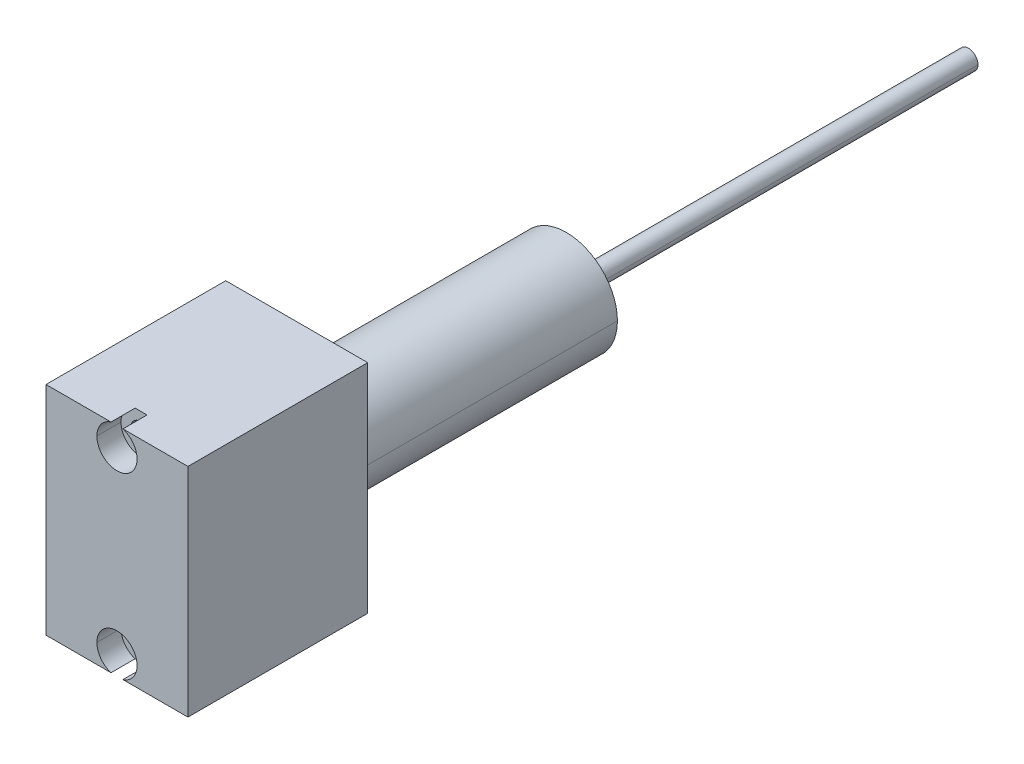
ISO-10303-21;
HEADER;
FILE_DESCRIPTION(('STEP AP214'),'2;1');
FILE_NAME('part.step','',(''),(''),'','','');
FILE_SCHEMA(('AUTOMOTIVE_DESIGN { 1 0 10303 214 1 1 1 1 }'));
ENDSEC;
DATA;
#1=APPLICATION_CONTEXT('core data for automotive mechanical design processes');
#2=APPLICATION_PROTOCOL_DEFINITION('international standard','automotive_design',2000,#1);
#3=PRODUCT_CONTEXT('',#1,'mechanical');
#4=PRODUCT('Part','Part','',(#3));
#5=PRODUCT_RELATED_PRODUCT_CATEGORY('part','',(#4));
#6=PRODUCT_DEFINITION_FORMATION('','',#4);
#7=PRODUCT_DEFINITION_CONTEXT('part definition',#1,'design');
#8=PRODUCT_DEFINITION('design','',#6,#7);
#9=PRODUCT_DEFINITION_SHAPE('','',#8);
#10=(LENGTH_UNIT() NAMED_UNIT(*) SI_UNIT(.MILLI.,.METRE.));
#11=(NAMED_UNIT(*) PLANE_ANGLE_UNIT() SI_UNIT($,.RADIAN.));
#12=(NAMED_UNIT(*) SI_UNIT($,.STERADIAN.) SOLID_ANGLE_UNIT());
#13=UNCERTAINTY_MEASURE_WITH_UNIT(LENGTH_MEASURE(1.E-05),#10,'distance_accuracy_value','');
#14=(GEOMETRIC_REPRESENTATION_CONTEXT(3) GLOBAL_UNCERTAINTY_ASSIGNED_CONTEXT((#13)) GLOBAL_UNIT_ASSIGNED_CONTEXT((#10,
#11,#12)) REPRESENTATION_CONTEXT('',''));
#15=CARTESIAN_POINT('',(0.,0.,0.));
#16=DIRECTION('',(0.,0.,1.));
#17=DIRECTION('',(1.,0.,0.));
#18=AXIS2_PLACEMENT_3D('',#15,#16,#17);
#19=CARTESIAN_POINT('',(-76.,-20.,853.422000000895));
#20=DIRECTION('',(0.,0.,1.));
#21=DIRECTION('',(1.,0.,0.));
#22=AXIS2_PLACEMENT_3D('',#19,#20,#21);
#23=CYLINDRICAL_SURFACE('',#22,1.19);
#24=CARTESIAN_POINT('',(-76.,-20.,853.422000000895));
#25=DIRECTION('',(0.,0.,-1.));
#26=DIRECTION('',(-1.,0.,0.));
#27=AXIS2_PLACEMENT_3D('',#24,#25,#26);
#28=CIRCLE('',#27,1.19);
#29=CARTESIAN_POINT('',(-77.19,-20.,853.422000000895));
#30=VERTEX_POINT('',#29);
#31=CARTESIAN_POINT('',(-74.81,-20.,853.422000000895));
#32=VERTEX_POINT('',#31);
#33=EDGE_CURVE('E41',#30,#32,#28,.T.);
#34=ORIENTED_EDGE('',*,*,#33,.F.);
#35=DIRECTION('',(0.,0.,1.));
#36=VECTOR('',#35,1.);
#37=CARTESIAN_POINT('',(-77.19,-20.,853.422000000895));
#38=LINE('',#37,#36);
#39=CARTESIAN_POINT('',(-77.19,-20.,903.422000000895));
#40=VERTEX_POINT('',#39);
#41=EDGE_CURVE('E11',#30,#40,#38,.T.);
#42=ORIENTED_EDGE('',*,*,#41,.T.);
#43=CARTESIAN_POINT('',(-76.,-20.,903.422000000895));
#44=DIRECTION('',(0.,0.,-1.));
#45=DIRECTION('',(-1.,0.,0.));
#46=AXIS2_PLACEMENT_3D('',#43,#44,#45);
#47=CIRCLE('',#46,1.19);
#48=CARTESIAN_POINT('',(-74.81,-20.,903.422000000895));
#49=VERTEX_POINT('',#48);
#50=EDGE_CURVE('E27',#40,#49,#47,.T.);
#51=ORIENTED_EDGE('',*,*,#50,.T.);
#52=DIRECTION('',(0.,0.,1.));
#53=VECTOR('',#52,1.);
#54=CARTESIAN_POINT('',(-74.81,-20.,853.422000000895));
#55=LINE('',#54,#53);
#56=EDGE_CURVE('E156',#32,#49,#55,.T.);
#57=ORIENTED_EDGE('',*,*,#56,.F.);
#58=EDGE_LOOP('',(#34,#42,#51,#57));
#59=FACE_BOUND('',#58,.T.);
#60=ADVANCED_FACE('F16',(#59),#23,.T.);
#61=CARTESIAN_POINT('',(-76.,-20.,903.422000000895));
#62=DIRECTION('',(0.,0.,1.));
#63=DIRECTION('',(1.,0.,0.));
#64=AXIS2_PLACEMENT_3D('',#61,#62,#63);
#65=CYLINDRICAL_SURFACE('',#64,6.35);
#66=CARTESIAN_POINT('',(-76.,-20.,903.422000000895));
#67=DIRECTION('',(0.,0.,-1.));
#68=DIRECTION('',(-1.,0.,0.));
#69=AXIS2_PLACEMENT_3D('',#66,#67,#68);
#70=CIRCLE('',#69,6.35);
#71=CARTESIAN_POINT('',(-82.35,-20.,903.422000000895));
#72=VERTEX_POINT('',#71);
#73=CARTESIAN_POINT('',(-69.65,-20.,903.422000000895));
#74=VERTEX_POINT('',#73);
#75=EDGE_CURVE('E264',#72,#74,#70,.T.);
#76=ORIENTED_EDGE('',*,*,#75,.F.);
#77=DIRECTION('',(0.,0.,1.));
#78=VECTOR('',#77,1.);
#79=CARTESIAN_POINT('',(-82.35,-20.,903.422000000895));
#80=LINE('',#79,#78);
#81=CARTESIAN_POINT('',(-82.35,-20.,936.950000000895));
#82=VERTEX_POINT('',#81);
#83=EDGE_CURVE('E247',#72,#82,#80,.T.);
#84=ORIENTED_EDGE('',*,*,#83,.T.);
#85=CARTESIAN_POINT('',(-76.,-20.,936.950000000895));
#86=DIRECTION('',(0.,0.,-1.));
#87=DIRECTION('',(-1.,0.,0.));
#88=AXIS2_PLACEMENT_3D('',#85,#86,#87);
#89=CIRCLE('',#88,6.35);
#90=CARTESIAN_POINT('',(-69.65,-20.,936.950000000895));
#91=VERTEX_POINT('',#90);
#92=EDGE_CURVE('E181',#82,#91,#89,.T.);
#93=ORIENTED_EDGE('',*,*,#92,.T.);
#94=DIRECTION('',(0.,0.,1.));
#95=VECTOR('',#94,1.);
#96=CARTESIAN_POINT('',(-69.65,-20.,903.422000000895));
#97=LINE('',#96,#95);
#98=EDGE_CURVE('E170',#74,#91,#97,.T.);
#99=ORIENTED_EDGE('',*,*,#98,.F.);
#100=EDGE_LOOP('',(#76,#84,#93,#99));
#101=FACE_BOUND('',#100,.T.);
#102=ADVANCED_FACE('F18',(#101),#65,.T.);
#103=CARTESIAN_POINT('',(-76.,-31.1125,956.302000000895));
#104=DIRECTION('',(0.,0.,1.));
#105=DIRECTION('',(1.,0.,0.));
#106=AXIS2_PLACEMENT_3D('',#103,#104,#105);
#107=CYLINDRICAL_SURFACE('',#106,2.5);
#108=CARTESIAN_POINT('',(-76.,-31.1125,956.302000000895));
#109=DIRECTION('',(0.,0.,1.));
#110=DIRECTION('',(1.,0.,0.));
#111=AXIS2_PLACEMENT_3D('',#108,#109,#110);
#112=CIRCLE('',#111,2.5);
#113=CARTESIAN_POINT('',(-78.5,-31.1125,956.302000000895));
#114=VERTEX_POINT('',#113);
#115=CARTESIAN_POINT('',(-76.7415144974982,-33.5,956.302000000895));
#116=VERTEX_POINT('',#115);
#117=EDGE_CURVE('E353',#114,#116,#112,.T.);
#118=ORIENTED_EDGE('',*,*,#117,.F.);
#119=DIRECTION('',(0.,0.,1.));
#120=VECTOR('',#119,1.);
#121=CARTESIAN_POINT('',(-78.5,-31.1125,956.302000000895));
#122=LINE('',#121,#120);
#123=CARTESIAN_POINT('',(-78.5,-31.1125,959.302000000895));
#124=VERTEX_POINT('',#123);
#125=EDGE_CURVE('E282',#114,#124,#122,.T.);
#126=ORIENTED_EDGE('',*,*,#125,.T.);
#127=CARTESIAN_POINT('',(-76.,-31.1125,959.302000000895));
#128=DIRECTION('',(0.,0.,1.));
#129=DIRECTION('',(1.,0.,0.));
#130=AXIS2_PLACEMENT_3D('',#127,#128,#129);
#131=CIRCLE('',#130,2.5);
#132=CARTESIAN_POINT('',(-76.7415144974982,-33.5,959.302000000895));
#133=VERTEX_POINT('',#132);
#134=EDGE_CURVE('E285',#124,#133,#131,.T.);
#135=ORIENTED_EDGE('',*,*,#134,.T.);
#136=DIRECTION('',(0.,0.,1.));
#137=VECTOR('',#136,1.);
#138=CARTESIAN_POINT('',(-76.7415144974982,-33.5,956.302000000895));
#139=LINE('',#138,#137);
#140=EDGE_CURVE('E291',#116,#133,#139,.T.);
#141=ORIENTED_EDGE('',*,*,#140,.F.);
#142=EDGE_LOOP('',(#118,#126,#135,#141));
#143=FACE_BOUND('',#142,.T.);
#144=ADVANCED_FACE('F444',(#143),#107,.F.);
#145=CARTESIAN_POINT('',(-76.,-31.1125,956.302000000895));
#146=DIRECTION('',(0.,0.,1.));
#147=DIRECTION('',(1.,0.,0.));
#148=AXIS2_PLACEMENT_3D('',#145,#146,#147);
#149=CYLINDRICAL_SURFACE('',#148,2.5);
#150=ORIENTED_EDGE('',*,*,#125,.F.);
#151=CARTESIAN_POINT('',(-76.,-31.1125,956.302000000895));
#152=DIRECTION('',(0.,0.,1.));
#153=DIRECTION('',(1.,0.,0.));
#154=AXIS2_PLACEMENT_3D('',#151,#152,#153);
#155=CIRCLE('',#154,2.5);
#156=CARTESIAN_POINT('',(-73.5,-31.1125,956.302000000895));
#157=VERTEX_POINT('',#156);
#158=EDGE_CURVE('E20',#157,#114,#155,.T.);
#159=ORIENTED_EDGE('',*,*,#158,.F.);
#160=DIRECTION('',(0.,0.,1.));
#161=VECTOR('',#160,1.);
#162=CARTESIAN_POINT('',(-73.5,-31.1125,956.302000000895));
#163=LINE('',#162,#161);
#164=CARTESIAN_POINT('',(-73.5,-31.1125,959.302000000895));
#165=VERTEX_POINT('',#164);
#166=EDGE_CURVE('E311',#157,#165,#163,.T.);
#167=ORIENTED_EDGE('',*,*,#166,.T.);
#168=CARTESIAN_POINT('',(-76.,-31.1125,959.302000000895));
#169=DIRECTION('',(0.,0.,1.));
#170=DIRECTION('',(1.,0.,0.));
#171=AXIS2_PLACEMENT_3D('',#168,#169,#170);
#172=CIRCLE('',#171,2.5);
#173=EDGE_CURVE('E307',#165,#124,#172,.T.);
#174=ORIENTED_EDGE('',*,*,#173,.T.);
#175=EDGE_LOOP('',(#150,#159,#167,#174));
#176=FACE_BOUND('',#175,.T.);
#177=ADVANCED_FACE('F449',(#176),#149,.F.);
#178=CARTESIAN_POINT('',(-76.,-8.8875,956.302000000895));
#179=DIRECTION('',(0.,0.,1.));
#180=DIRECTION('',(1.,0.,0.));
#181=AXIS2_PLACEMENT_3D('',#178,#179,#180);
#182=CYLINDRICAL_SURFACE('',#181,2.5);
#183=CARTESIAN_POINT('',(-76.,-8.8875,956.302000000895));
#184=DIRECTION('',(0.,0.,1.));
#185=DIRECTION('',(1.,0.,0.));
#186=AXIS2_PLACEMENT_3D('',#183,#184,#185);
#187=CIRCLE('',#186,2.5);
#188=CARTESIAN_POINT('',(-78.5,-8.8875,956.302000000895));
#189=VERTEX_POINT('',#188);
#190=CARTESIAN_POINT('',(-73.5,-8.8875,956.302000000895));
#191=VERTEX_POINT('',#190);
#192=EDGE_CURVE('E221',#189,#191,#187,.T.);
#193=ORIENTED_EDGE('',*,*,#192,.F.);
#194=DIRECTION('',(0.,0.,1.));
#195=VECTOR('',#194,1.);
#196=CARTESIAN_POINT('',(-78.5,-8.8875,956.302000000895));
#197=LINE('',#196,#195);
#198=CARTESIAN_POINT('',(-78.5,-8.8875,959.302000000895));
#199=VERTEX_POINT('',#198);
#200=EDGE_CURVE('E219',#189,#199,#197,.T.);
#201=ORIENTED_EDGE('',*,*,#200,.T.);
#202=CARTESIAN_POINT('',(-76.,-8.8875,959.302000000895));
#203=DIRECTION('',(0.,0.,1.));
#204=DIRECTION('',(1.,0.,0.));
#205=AXIS2_PLACEMENT_3D('',#202,#203,#204);
#206=CIRCLE('',#205,2.5);
#207=CARTESIAN_POINT('',(-73.5,-8.8875,959.302000000895));
#208=VERTEX_POINT('',#207);
#209=EDGE_CURVE('E325',#199,#208,#206,.T.);
#210=ORIENTED_EDGE('',*,*,#209,.T.);
#211=DIRECTION('',(0.,0.,1.));
#212=VECTOR('',#211,1.);
#213=CARTESIAN_POINT('',(-73.5,-8.8875,956.302000000895));
#214=LINE('',#213,#212);
#215=EDGE_CURVE('E318',#191,#208,#214,.T.);
#216=ORIENTED_EDGE('',*,*,#215,.F.);
#217=EDGE_LOOP('',(#193,#201,#210,#216));
#218=FACE_BOUND('',#217,.T.);
#219=ADVANCED_FACE('F452',(#218),#182,.F.);
#220=CARTESIAN_POINT('',(-76.,-8.8875,956.302000000895));
#221=DIRECTION('',(0.,0.,1.));
#222=DIRECTION('',(1.,0.,0.));
#223=AXIS2_PLACEMENT_3D('',#220,#221,#222);
#224=CYLINDRICAL_SURFACE('',#223,2.5);
#225=CARTESIAN_POINT('',(-76.,-8.8875,956.302000000895));
#226=DIRECTION('',(0.,0.,1.));
#227=DIRECTION('',(1.,0.,0.));
#228=AXIS2_PLACEMENT_3D('',#225,#226,#227);
#229=CIRCLE('',#228,2.5);
#230=CARTESIAN_POINT('',(-75.2584855025018,-6.5,956.302000000895));
#231=VERTEX_POINT('',#230);
#232=EDGE_CURVE('E199',#191,#231,#229,.T.);
#233=ORIENTED_EDGE('',*,*,#232,.F.);
#234=ORIENTED_EDGE('',*,*,#215,.T.);
#235=CARTESIAN_POINT('',(-76.,-8.8875,959.302000000895));
#236=DIRECTION('',(0.,0.,1.));
#237=DIRECTION('',(1.,0.,0.));
#238=AXIS2_PLACEMENT_3D('',#235,#236,#237);
#239=CIRCLE('',#238,2.5);
#240=CARTESIAN_POINT('',(-75.2584855025018,-6.5,959.302000000895));
#241=VERTEX_POINT('',#240);
#242=EDGE_CURVE('E314',#208,#241,#239,.T.);
#243=ORIENTED_EDGE('',*,*,#242,.T.);
#244=DIRECTION('',(0.,0.,1.));
#245=VECTOR('',#244,1.);
#246=CARTESIAN_POINT('',(-75.2584855025018,-6.5,956.302000000895));
#247=LINE('',#246,#245);
#248=EDGE_CURVE('E301',#231,#241,#247,.T.);
#249=ORIENTED_EDGE('',*,*,#248,.F.);
#250=EDGE_LOOP('',(#233,#234,#243,#249));
#251=FACE_BOUND('',#250,.T.);
#252=ADVANCED_FACE('F448',(#251),#224,.F.);
#253=CARTESIAN_POINT('',(-76.,-8.8875,936.950000000895));
#254=DIRECTION('',(0.,0.,1.));
#255=DIRECTION('',(1.,0.,0.));
#256=AXIS2_PLACEMENT_3D('',#253,#254,#255);
#257=CYLINDRICAL_SURFACE('',#256,1.3);
#258=CARTESIAN_POINT('',(-76.,-8.8875,936.950000000895));
#259=DIRECTION('',(0.,0.,1.));
#260=DIRECTION('',(1.,0.,0.));
#261=AXIS2_PLACEMENT_3D('',#258,#259,#260);
#262=CIRCLE('',#261,1.3);
#263=CARTESIAN_POINT('',(-77.3,-8.8875,936.950000000895));
#264=VERTEX_POINT('',#263);
#265=CARTESIAN_POINT('',(-74.7,-8.8875,936.950000000895));
#266=VERTEX_POINT('',#265);
#267=EDGE_CURVE('E277',#264,#266,#262,.T.);
#268=ORIENTED_EDGE('',*,*,#267,.F.);
#269=DIRECTION('',(0.,0.,1.));
#270=VECTOR('',#269,1.);
#271=CARTESIAN_POINT('',(-77.3,-8.8875,936.950000000895));
#272=LINE('',#271,#270);
#273=CARTESIAN_POINT('',(-77.3,-8.8875,956.302000000895));
#274=VERTEX_POINT('',#273);
#275=EDGE_CURVE('E319',#264,#274,#272,.T.);
#276=ORIENTED_EDGE('',*,*,#275,.T.);
#277=CARTESIAN_POINT('',(-76.,-8.8875,956.302000000895));
#278=DIRECTION('',(0.,0.,-1.));
#279=DIRECTION('',(1.,0.,0.));
#280=AXIS2_PLACEMENT_3D('',#277,#278,#279);
#281=CIRCLE('',#280,1.3);
#282=CARTESIAN_POINT('',(-74.7,-8.8875,956.302000000895));
#283=VERTEX_POINT('',#282);
#284=EDGE_CURVE('E257',#283,#274,#281,.T.);
#285=ORIENTED_EDGE('',*,*,#284,.F.);
#286=DIRECTION('',(0.,0.,1.));
#287=VECTOR('',#286,1.);
#288=CARTESIAN_POINT('',(-74.7,-8.8875,936.950000000895));
#289=LINE('',#288,#287);
#290=EDGE_CURVE('E244',#266,#283,#289,.T.);
#291=ORIENTED_EDGE('',*,*,#290,.F.);
#292=EDGE_LOOP('',(#268,#276,#285,#291));
#293=FACE_BOUND('',#292,.T.);
#294=ADVANCED_FACE('F424',(#293),#257,.F.);
#295=CARTESIAN_POINT('',(-76.,-31.1125,936.950000000895));
#296=DIRECTION('',(0.,0.,1.));
#297=DIRECTION('',(1.,0.,0.));
#298=AXIS2_PLACEMENT_3D('',#295,#296,#297);
#299=CYLINDRICAL_SURFACE('',#298,1.19972449295151);
#300=CARTESIAN_POINT('',(-76.,-31.1125,936.950000000895));
#301=DIRECTION('',(0.,0.,1.));
#302=DIRECTION('',(1.,0.,0.));
#303=AXIS2_PLACEMENT_3D('',#300,#301,#302);
#304=CIRCLE('',#303,1.19972449295151);
#305=CARTESIAN_POINT('',(-77.1997244929515,-31.1125,936.950000000895));
#306=VERTEX_POINT('',#305);
#307=CARTESIAN_POINT('',(-74.8002755070485,-31.1125,936.950000000895));
#308=VERTEX_POINT('',#307);
#309=EDGE_CURVE('E243',#306,#308,#304,.T.);
#310=ORIENTED_EDGE('',*,*,#309,.F.);
#311=DIRECTION('',(0.,0.,1.));
#312=VECTOR('',#311,1.);
#313=CARTESIAN_POINT('',(-77.1997244929515,-31.1125,936.950000000895));
#314=LINE('',#313,#312);
#315=CARTESIAN_POINT('',(-77.1997244929515,-31.1125,956.302000000895));
#316=VERTEX_POINT('',#315);
#317=EDGE_CURVE('E329',#306,#316,#314,.T.);
#318=ORIENTED_EDGE('',*,*,#317,.T.);
#319=CARTESIAN_POINT('',(-76.,-31.1125,956.302000000895));
#320=DIRECTION('',(0.,0.,-1.));
#321=DIRECTION('',(1.,0.,0.));
#322=AXIS2_PLACEMENT_3D('',#319,#320,#321);
#323=CIRCLE('',#322,1.19972449295151);
#324=CARTESIAN_POINT('',(-74.8002755070485,-31.1125,956.302000000895));
#325=VERTEX_POINT('',#324);
#326=EDGE_CURVE('E347',#325,#316,#323,.T.);
#327=ORIENTED_EDGE('',*,*,#326,.F.);
#328=DIRECTION('',(0.,0.,1.));
#329=VECTOR('',#328,1.);
#330=CARTESIAN_POINT('',(-74.8002755070485,-31.1125,936.950000000895));
#331=LINE('',#330,#329);
#332=EDGE_CURVE('E239',#308,#325,#331,.T.);
#333=ORIENTED_EDGE('',*,*,#332,.F.);
#334=EDGE_LOOP('',(#310,#318,#327,#333));
#335=FACE_BOUND('',#334,.T.);
#336=ADVANCED_FACE('F454',(#335),#299,.F.);
#337=CARTESIAN_POINT('',(-76.,-20.,903.422000000895));
#338=DIRECTION('',(0.,0.,-1.));
#339=DIRECTION('',(-1.,0.,0.));
#340=AXIS2_PLACEMENT_3D('',#337,#338,#339);
#341=PLANE('',#340);
#342=CARTESIAN_POINT('',(-76.,-20.,903.422000000895));
#343=DIRECTION('',(0.,0.,-1.));
#344=DIRECTION('',(-1.,0.,0.));
#345=AXIS2_PLACEMENT_3D('',#342,#343,#344);
#346=CIRCLE('',#345,6.35);
#347=EDGE_CURVE('E268',#74,#72,#346,.T.);
#348=ORIENTED_EDGE('',*,*,#347,.T.);
#349=ORIENTED_EDGE('',*,*,#75,.T.);
#350=EDGE_LOOP('',(#348,#349));
#351=FACE_BOUND('',#350,.T.);
#352=CARTESIAN_POINT('',(-76.,-20.,903.422000000895));
#353=DIRECTION('',(0.,0.,-1.));
#354=DIRECTION('',(-1.,0.,0.));
#355=AXIS2_PLACEMENT_3D('',#352,#353,#354);
#356=CIRCLE('',#355,1.19);
#357=EDGE_CURVE('E232',#49,#40,#356,.T.);
#358=ORIENTED_EDGE('',*,*,#357,.F.);
#359=ORIENTED_EDGE('',*,*,#50,.F.);
#360=EDGE_LOOP('',(#358,#359));
#361=FACE_BOUND('',#360,.T.);
#362=ADVANCED_FACE('F457',(#351,#361),#341,.T.);
#363=CARTESIAN_POINT('',(-76.,-20.,936.950000000895));
#364=DIRECTION('',(0.,0.,-1.));
#365=DIRECTION('',(-1.,0.,0.));
#366=AXIS2_PLACEMENT_3D('',#363,#364,#365);
#367=PLANE('',#366);
#368=DIRECTION('',(0.,-1.,0.));
#369=VECTOR('',#368,1.);
#370=CARTESIAN_POINT('',(-67.175,-33.5,936.950000000895));
#371=LINE('',#370,#369);
#372=CARTESIAN_POINT('',(-67.175,-6.5,936.950000000895));
#373=VERTEX_POINT('',#372);
#374=CARTESIAN_POINT('',(-67.175,-33.5,936.950000000895));
#375=VERTEX_POINT('',#374);
#376=EDGE_CURVE('E237',#373,#375,#371,.T.);
#377=ORIENTED_EDGE('',*,*,#376,.T.);
#378=DIRECTION('',(-1.,0.,0.));
#379=VECTOR('',#378,1.);
#380=CARTESIAN_POINT('',(-84.825,-33.5,936.950000000895));
#381=LINE('',#380,#379);
#382=CARTESIAN_POINT('',(-84.825,-33.5,936.950000000895));
#383=VERTEX_POINT('',#382);
#384=EDGE_CURVE('E233',#375,#383,#381,.T.);
#385=ORIENTED_EDGE('',*,*,#384,.T.);
#386=DIRECTION('',(0.,1.,0.));
#387=VECTOR('',#386,1.);
#388=CARTESIAN_POINT('',(-84.825,-33.5,936.950000000895));
#389=LINE('',#388,#387);
#390=CARTESIAN_POINT('',(-84.825,-6.5,936.950000000895));
#391=VERTEX_POINT('',#390);
#392=EDGE_CURVE('E238',#383,#391,#389,.T.);
#393=ORIENTED_EDGE('',*,*,#392,.T.);
#394=DIRECTION('',(1.,0.,0.));
#395=VECTOR('',#394,1.);
#396=CARTESIAN_POINT('',(-84.825,-6.5,936.950000000895));
#397=LINE('',#396,#395);
#398=EDGE_CURVE('E368',#391,#373,#397,.T.);
#399=ORIENTED_EDGE('',*,*,#398,.T.);
#400=EDGE_LOOP('',(#377,#385,#393,#399));
#401=FACE_BOUND('',#400,.T.);
#402=CARTESIAN_POINT('',(-76.,-8.8875,936.950000000895));
#403=DIRECTION('',(0.,0.,1.));
#404=DIRECTION('',(1.,0.,0.));
#405=AXIS2_PLACEMENT_3D('',#402,#403,#404);
#406=CIRCLE('',#405,1.3);
#407=EDGE_CURVE('E371',#266,#264,#406,.T.);
#408=ORIENTED_EDGE('',*,*,#407,.T.);
#409=ORIENTED_EDGE('',*,*,#267,.T.);
#410=EDGE_LOOP('',(#408,#409));
#411=FACE_BOUND('',#410,.T.);
#412=CARTESIAN_POINT('',(-76.,-31.1125,936.950000000895));
#413=DIRECTION('',(0.,0.,1.));
#414=DIRECTION('',(1.,0.,0.));
#415=AXIS2_PLACEMENT_3D('',#412,#413,#414);
#416=CIRCLE('',#415,1.19972449295151);
#417=EDGE_CURVE('E273',#308,#306,#416,.T.);
#418=ORIENTED_EDGE('',*,*,#417,.T.);
#419=ORIENTED_EDGE('',*,*,#309,.T.);
#420=EDGE_LOOP('',(#418,#419));
#421=FACE_BOUND('',#420,.T.);
#422=CARTESIAN_POINT('',(-76.,-20.,936.950000000895));
#423=DIRECTION('',(0.,0.,-1.));
#424=DIRECTION('',(-1.,0.,0.));
#425=AXIS2_PLACEMENT_3D('',#422,#423,#424);
#426=CIRCLE('',#425,6.35);
#427=EDGE_CURVE('E231',#91,#82,#426,.T.);
#428=ORIENTED_EDGE('',*,*,#427,.F.);
#429=ORIENTED_EDGE('',*,*,#92,.F.);
#430=EDGE_LOOP('',(#428,#429));
#431=FACE_BOUND('',#430,.T.);
#432=ADVANCED_FACE('F417',(#401,#411,#421,#431),#367,.T.);
#433=CARTESIAN_POINT('',(-76.,-31.1125,936.950000000895));
#434=DIRECTION('',(0.,0.,1.));
#435=DIRECTION('',(1.,0.,0.));
#436=AXIS2_PLACEMENT_3D('',#433,#434,#435);
#437=CYLINDRICAL_SURFACE('',#436,1.19972449295151);
#438=ORIENTED_EDGE('',*,*,#317,.F.);
#439=ORIENTED_EDGE('',*,*,#417,.F.);
#440=ORIENTED_EDGE('',*,*,#332,.T.);
#441=CARTESIAN_POINT('',(-76.,-31.1125,956.302000000895));
#442=DIRECTION('',(0.,0.,-1.));
#443=DIRECTION('',(1.,0.,0.));
#444=AXIS2_PLACEMENT_3D('',#441,#442,#443);
#445=CIRCLE('',#444,1.19972449295151);
#446=EDGE_CURVE('E300',#316,#325,#445,.T.);
#447=ORIENTED_EDGE('',*,*,#446,.F.);
#448=EDGE_LOOP('',(#438,#439,#440,#447));
#449=FACE_BOUND('',#448,.T.);
#450=ADVANCED_FACE('F467',(#449),#437,.F.);
#451=CARTESIAN_POINT('',(-76.,-8.8875,936.950000000895));
#452=DIRECTION('',(0.,0.,1.));
#453=DIRECTION('',(1.,0.,0.));
#454=AXIS2_PLACEMENT_3D('',#451,#452,#453);
#455=CYLINDRICAL_SURFACE('',#454,1.3);
#456=ORIENTED_EDGE('',*,*,#275,.F.);
#457=ORIENTED_EDGE('',*,*,#407,.F.);
#458=ORIENTED_EDGE('',*,*,#290,.T.);
#459=CARTESIAN_POINT('',(-76.,-8.8875,956.302000000895));
#460=DIRECTION('',(0.,0.,-1.));
#461=DIRECTION('',(1.,0.,0.));
#462=AXIS2_PLACEMENT_3D('',#459,#460,#461);
#463=CIRCLE('',#462,1.3);
#464=EDGE_CURVE('E253',#274,#283,#463,.T.);
#465=ORIENTED_EDGE('',*,*,#464,.F.);
#466=EDGE_LOOP('',(#456,#457,#458,#465));
#467=FACE_BOUND('',#466,.T.);
#468=ADVANCED_FACE('F421',(#467),#455,.F.);
#469=CARTESIAN_POINT('',(-67.175,-33.5,936.950000000895));
#470=DIRECTION('',(-1.,0.,0.));
#471=DIRECTION('',(0.,1.,0.));
#472=AXIS2_PLACEMENT_3D('',#469,#470,#471);
#473=PLANE('',#472);
#474=DIRECTION('',(0.,-1.,0.));
#475=VECTOR('',#474,1.);
#476=CARTESIAN_POINT('',(-67.175,-33.5,959.302000000895));
#477=LINE('',#476,#475);
#478=CARTESIAN_POINT('',(-67.175,-6.5,959.302000000895));
#479=VERTEX_POINT('',#478);
#480=CARTESIAN_POINT('',(-67.175,-33.5,959.302000000895));
#481=VERTEX_POINT('',#480);
#482=EDGE_CURVE('E388',#479,#481,#477,.T.);
#483=ORIENTED_EDGE('',*,*,#482,.T.);
#484=DIRECTION('',(0.,0.,1.));
#485=VECTOR('',#484,1.);
#486=CARTESIAN_POINT('',(-67.175,-33.5,936.950000000895));
#487=LINE('',#486,#485);
#488=EDGE_CURVE('E248',#375,#481,#487,.T.);
#489=ORIENTED_EDGE('',*,*,#488,.F.);
#490=ORIENTED_EDGE('',*,*,#376,.F.);
#491=DIRECTION('',(0.,0.,1.));
#492=VECTOR('',#491,1.);
#493=CARTESIAN_POINT('',(-67.175,-6.5,936.950000000895));
#494=LINE('',#493,#492);
#495=EDGE_CURVE('E295',#373,#479,#494,.T.);
#496=ORIENTED_EDGE('',*,*,#495,.T.);
#497=EDGE_LOOP('',(#483,#489,#490,#496));
#498=FACE_BOUND('',#497,.T.);
#499=ADVANCED_FACE('F469',(#498),#473,.F.);
#500=CARTESIAN_POINT('',(-84.825,-33.5,936.950000000895));
#501=DIRECTION('',(0.,1.,0.));
#502=DIRECTION('',(-1.,0.,0.));
#503=AXIS2_PLACEMENT_3D('',#500,#501,#502);
#504=PLANE('',#503);
#505=DIRECTION('',(1.,0.,0.));
#506=VECTOR('',#505,1.);
#507=CARTESIAN_POINT('',(-84.825,-33.5,956.302000000895));
#508=LINE('',#507,#506);
#509=CARTESIAN_POINT('',(-75.2584855025018,-33.5,956.302000000895));
#510=VERTEX_POINT('',#509);
#511=EDGE_CURVE('E259',#116,#510,#508,.T.);
#512=ORIENTED_EDGE('',*,*,#511,.F.);
#513=ORIENTED_EDGE('',*,*,#140,.T.);
#514=DIRECTION('',(-1.,0.,0.));
#515=VECTOR('',#514,1.);
#516=CARTESIAN_POINT('',(-84.825,-33.5,959.302000000895));
#517=LINE('',#516,#515);
#518=CARTESIAN_POINT('',(-84.825,-33.5,959.302000000895));
#519=VERTEX_POINT('',#518);
#520=EDGE_CURVE('E251',#133,#519,#517,.T.);
#521=ORIENTED_EDGE('',*,*,#520,.T.);
#522=DIRECTION('',(0.,0.,1.));
#523=VECTOR('',#522,1.);
#524=CARTESIAN_POINT('',(-84.825,-33.5,936.950000000895));
#525=LINE('',#524,#523);
#526=EDGE_CURVE('E303',#383,#519,#525,.T.);
#527=ORIENTED_EDGE('',*,*,#526,.F.);
#528=ORIENTED_EDGE('',*,*,#384,.F.);
#529=ORIENTED_EDGE('',*,*,#488,.T.);
#530=DIRECTION('',(-1.,0.,0.));
#531=VECTOR('',#530,1.);
#532=CARTESIAN_POINT('',(-84.825,-33.5,959.302000000895));
#533=LINE('',#532,#531);
#534=CARTESIAN_POINT('',(-75.2584855025018,-33.5,959.302000000895));
#535=VERTEX_POINT('',#534);
#536=EDGE_CURVE('E252',#481,#535,#533,.T.);
#537=ORIENTED_EDGE('',*,*,#536,.T.);
#538=DIRECTION('',(0.,0.,-1.));
#539=VECTOR('',#538,1.);
#540=CARTESIAN_POINT('',(-75.2584855025018,-33.5,956.302000000895));
#541=LINE('',#540,#539);
#542=EDGE_CURVE('E272',#535,#510,#541,.T.);
#543=ORIENTED_EDGE('',*,*,#542,.T.);
#544=EDGE_LOOP('',(#512,#513,#521,#527,#528,#529,#537,#543));
#545=FACE_BOUND('',#544,.T.);
#546=ADVANCED_FACE('F472',(#545),#504,.F.);
#547=CARTESIAN_POINT('',(-84.825,-33.5,936.950000000895));
#548=DIRECTION('',(1.,0.,0.));
#549=DIRECTION('',(0.,0.,-1.));
#550=AXIS2_PLACEMENT_3D('',#547,#548,#549);
#551=PLANE('',#550);
#552=DIRECTION('',(0.,1.,0.));
#553=VECTOR('',#552,1.);
#554=CARTESIAN_POINT('',(-84.825,-33.5,959.302000000895));
#555=LINE('',#554,#553);
#556=CARTESIAN_POINT('',(-84.825,-6.5,959.302000000895));
#557=VERTEX_POINT('',#556);
#558=EDGE_CURVE('E281',#519,#557,#555,.T.);
#559=ORIENTED_EDGE('',*,*,#558,.T.);
#560=DIRECTION('',(0.,0.,1.));
#561=VECTOR('',#560,1.);
#562=CARTESIAN_POINT('',(-84.825,-6.5,936.950000000895));
#563=LINE('',#562,#561);
#564=EDGE_CURVE('E287',#391,#557,#563,.T.);
#565=ORIENTED_EDGE('',*,*,#564,.F.);
#566=ORIENTED_EDGE('',*,*,#392,.F.);
#567=ORIENTED_EDGE('',*,*,#526,.T.);
#568=EDGE_LOOP('',(#559,#565,#566,#567));
#569=FACE_BOUND('',#568,.T.);
#570=ADVANCED_FACE('F474',(#569),#551,.F.);
#571=CARTESIAN_POINT('',(-84.825,-6.5,936.950000000895));
#572=DIRECTION('',(0.,-1.,0.));
#573=DIRECTION('',(0.,0.,1.));
#574=AXIS2_PLACEMENT_3D('',#571,#572,#573);
#575=PLANE('',#574);
#576=DIRECTION('',(-1.,0.,0.));
#577=VECTOR('',#576,1.);
#578=CARTESIAN_POINT('',(-84.825,-6.5,956.302000000895));
#579=LINE('',#578,#577);
#580=CARTESIAN_POINT('',(-76.7415144974982,-6.5,956.302000000895));
#581=VERTEX_POINT('',#580);
#582=EDGE_CURVE('E191',#231,#581,#579,.T.);
#583=ORIENTED_EDGE('',*,*,#582,.F.);
#584=ORIENTED_EDGE('',*,*,#248,.T.);
#585=DIRECTION('',(1.,0.,0.));
#586=VECTOR('',#585,1.);
#587=CARTESIAN_POINT('',(-84.825,-6.5,959.302000000895));
#588=LINE('',#587,#586);
#589=EDGE_CURVE('E290',#241,#479,#588,.T.);
#590=ORIENTED_EDGE('',*,*,#589,.T.);
#591=ORIENTED_EDGE('',*,*,#495,.F.);
#592=ORIENTED_EDGE('',*,*,#398,.F.);
#593=ORIENTED_EDGE('',*,*,#564,.T.);
#594=DIRECTION('',(1.,0.,0.));
#595=VECTOR('',#594,1.);
#596=CARTESIAN_POINT('',(-84.825,-6.5,959.302000000895));
#597=LINE('',#596,#595);
#598=CARTESIAN_POINT('',(-76.7415144974982,-6.5,959.302000000895));
#599=VERTEX_POINT('',#598);
#600=EDGE_CURVE('E210',#557,#599,#597,.T.);
#601=ORIENTED_EDGE('',*,*,#600,.T.);
#602=DIRECTION('',(0.,0.,-1.));
#603=VECTOR('',#602,1.);
#604=CARTESIAN_POINT('',(-76.7415144974982,-6.5,956.302000000895));
#605=LINE('',#604,#603);
#606=EDGE_CURVE('E207',#599,#581,#605,.T.);
#607=ORIENTED_EDGE('',*,*,#606,.T.);
#608=EDGE_LOOP('',(#583,#584,#590,#591,#592,#593,#601,#607));
#609=FACE_BOUND('',#608,.T.);
#610=ADVANCED_FACE('F208',(#609),#575,.F.);
#611=CARTESIAN_POINT('',(-76.,-20.,959.302000000895));
#612=DIRECTION('',(0.,0.,-1.));
#613=DIRECTION('',(-1.,0.,0.));
#614=AXIS2_PLACEMENT_3D('',#611,#612,#613);
#615=PLANE('',#614);
#616=ORIENTED_EDGE('',*,*,#520,.F.);
#617=ORIENTED_EDGE('',*,*,#134,.F.);
#618=ORIENTED_EDGE('',*,*,#173,.F.);
#619=CARTESIAN_POINT('',(-76.,-31.1125,959.302000000895));
#620=DIRECTION('',(0.,0.,1.));
#621=DIRECTION('',(1.,0.,0.));
#622=AXIS2_PLACEMENT_3D('',#619,#620,#621);
#623=CIRCLE('',#622,2.5);
#624=EDGE_CURVE('E258',#535,#165,#623,.T.);
#625=ORIENTED_EDGE('',*,*,#624,.F.);
#626=ORIENTED_EDGE('',*,*,#536,.F.);
#627=ORIENTED_EDGE('',*,*,#482,.F.);
#628=ORIENTED_EDGE('',*,*,#589,.F.);
#629=ORIENTED_EDGE('',*,*,#242,.F.);
#630=ORIENTED_EDGE('',*,*,#209,.F.);
#631=CARTESIAN_POINT('',(-76.,-8.8875,959.302000000895));
#632=DIRECTION('',(0.,0.,1.));
#633=DIRECTION('',(1.,0.,0.));
#634=AXIS2_PLACEMENT_3D('',#631,#632,#633);
#635=CIRCLE('',#634,2.5);
#636=EDGE_CURVE('E204',#599,#199,#635,.T.);
#637=ORIENTED_EDGE('',*,*,#636,.F.);
#638=ORIENTED_EDGE('',*,*,#600,.F.);
#639=ORIENTED_EDGE('',*,*,#558,.F.);
#640=EDGE_LOOP('',(#616,#617,#618,#625,#626,#627,#628,#629,#630,#637,#638,#639));
#641=FACE_BOUND('',#640,.T.);
#642=ADVANCED_FACE('F436',(#641),#615,.F.);
#643=CARTESIAN_POINT('',(-76.,-8.8875,956.302000000895));
#644=DIRECTION('',(0.,0.,1.));
#645=DIRECTION('',(1.,0.,0.));
#646=AXIS2_PLACEMENT_3D('',#643,#644,#645);
#647=CYLINDRICAL_SURFACE('',#646,2.5);
#648=ORIENTED_EDGE('',*,*,#200,.F.);
#649=CARTESIAN_POINT('',(-76.,-8.8875,956.302000000895));
#650=DIRECTION('',(0.,0.,1.));
#651=DIRECTION('',(1.,0.,0.));
#652=AXIS2_PLACEMENT_3D('',#649,#650,#651);
#653=CIRCLE('',#652,2.5);
#654=EDGE_CURVE('E197',#581,#189,#653,.T.);
#655=ORIENTED_EDGE('',*,*,#654,.F.);
#656=ORIENTED_EDGE('',*,*,#606,.F.);
#657=ORIENTED_EDGE('',*,*,#636,.T.);
#658=EDGE_LOOP('',(#648,#655,#656,#657));
#659=FACE_BOUND('',#658,.T.);
#660=ADVANCED_FACE('F217',(#659),#647,.F.);
#661=CARTESIAN_POINT('',(-76.,-8.8875,956.302000000895));
#662=DIRECTION('',(0.,0.,1.));
#663=DIRECTION('',(0.,-1.,0.));
#664=AXIS2_PLACEMENT_3D('',#661,#662,#663);
#665=PLANE('',#664);
#666=ORIENTED_EDGE('',*,*,#582,.T.);
#667=ORIENTED_EDGE('',*,*,#654,.T.);
#668=ORIENTED_EDGE('',*,*,#192,.T.);
#669=ORIENTED_EDGE('',*,*,#232,.T.);
#670=EDGE_LOOP('',(#666,#667,#668,#669));
#671=FACE_BOUND('',#670,.T.);
#672=ORIENTED_EDGE('',*,*,#284,.T.);
#673=ORIENTED_EDGE('',*,*,#464,.T.);
#674=EDGE_LOOP('',(#672,#673));
#675=FACE_BOUND('',#674,.T.);
#676=ADVANCED_FACE('F193',(#671,#675),#665,.T.);
#677=CARTESIAN_POINT('',(-76.,-31.1125,956.302000000895));
#678=DIRECTION('',(0.,0.,1.));
#679=DIRECTION('',(1.,0.,0.));
#680=AXIS2_PLACEMENT_3D('',#677,#678,#679);
#681=CYLINDRICAL_SURFACE('',#680,2.5);
#682=ORIENTED_EDGE('',*,*,#166,.F.);
#683=CARTESIAN_POINT('',(-76.,-31.1125,956.302000000895));
#684=DIRECTION('',(0.,0.,1.));
#685=DIRECTION('',(1.,0.,0.));
#686=AXIS2_PLACEMENT_3D('',#683,#684,#685);
#687=CIRCLE('',#686,2.5);
#688=EDGE_CURVE('E263',#510,#157,#687,.T.);
#689=ORIENTED_EDGE('',*,*,#688,.F.);
#690=ORIENTED_EDGE('',*,*,#542,.F.);
#691=ORIENTED_EDGE('',*,*,#624,.T.);
#692=EDGE_LOOP('',(#682,#689,#690,#691));
#693=FACE_BOUND('',#692,.T.);
#694=ADVANCED_FACE('F426',(#693),#681,.F.);
#695=CARTESIAN_POINT('',(-76.,-31.1125,956.302000000895));
#696=DIRECTION('',(0.,0.,1.));
#697=DIRECTION('',(0.,-1.,0.));
#698=AXIS2_PLACEMENT_3D('',#695,#696,#697);
#699=PLANE('',#698);
#700=ORIENTED_EDGE('',*,*,#511,.T.);
#701=ORIENTED_EDGE('',*,*,#688,.T.);
#702=ORIENTED_EDGE('',*,*,#158,.T.);
#703=ORIENTED_EDGE('',*,*,#117,.T.);
#704=EDGE_LOOP('',(#700,#701,#702,#703));
#705=FACE_BOUND('',#704,.T.);
#706=ORIENTED_EDGE('',*,*,#326,.T.);
#707=ORIENTED_EDGE('',*,*,#446,.T.);
#708=EDGE_LOOP('',(#706,#707));
#709=FACE_BOUND('',#708,.T.);
#710=ADVANCED_FACE('F433',(#705,#709),#699,.T.);
#711=CARTESIAN_POINT('',(-76.,-20.,903.422000000895));
#712=DIRECTION('',(0.,0.,1.));
#713=DIRECTION('',(1.,0.,0.));
#714=AXIS2_PLACEMENT_3D('',#711,#712,#713);
#715=CYLINDRICAL_SURFACE('',#714,6.35);
#716=ORIENTED_EDGE('',*,*,#83,.F.);
#717=ORIENTED_EDGE('',*,*,#347,.F.);
#718=ORIENTED_EDGE('',*,*,#98,.T.);
#719=ORIENTED_EDGE('',*,*,#427,.T.);
#720=EDGE_LOOP('',(#716,#717,#718,#719));
#721=FACE_BOUND('',#720,.T.);
#722=ADVANCED_FACE('F527',(#721),#715,.T.);
#723=CARTESIAN_POINT('',(-76.,-20.,853.422000000895));
#724=DIRECTION('',(0.,0.,1.));
#725=DIRECTION('',(1.,0.,0.));
#726=AXIS2_PLACEMENT_3D('',#723,#724,#725);
#727=CYLINDRICAL_SURFACE('',#726,1.19);
#728=ORIENTED_EDGE('',*,*,#41,.F.);
#729=CARTESIAN_POINT('',(-76.,-20.,853.422000000895));
#730=DIRECTION('',(0.,0.,-1.));
#731=DIRECTION('',(-1.,0.,0.));
#732=AXIS2_PLACEMENT_3D('',#729,#730,#731);
#733=CIRCLE('',#732,1.19);
#734=EDGE_CURVE('E322',#32,#30,#733,.T.);
#735=ORIENTED_EDGE('',*,*,#734,.F.);
#736=ORIENTED_EDGE('',*,*,#56,.T.);
#737=ORIENTED_EDGE('',*,*,#357,.T.);
#738=EDGE_LOOP('',(#728,#735,#736,#737));
#739=FACE_BOUND('',#738,.T.);
#740=ADVANCED_FACE('F530',(#739),#727,.T.);
#741=CARTESIAN_POINT('',(-76.,-20.,853.422000000895));
#742=DIRECTION('',(0.,0.,-1.));
#743=DIRECTION('',(-1.,0.,0.));
#744=AXIS2_PLACEMENT_3D('',#741,#742,#743);
#745=PLANE('',#744);
#746=ORIENTED_EDGE('',*,*,#734,.T.);
#747=ORIENTED_EDGE('',*,*,#33,.T.);
#748=EDGE_LOOP('',(#746,#747));
#749=FACE_BOUND('',#748,.T.);
#750=ADVANCED_FACE('F531',(#749),#745,.T.);
#751=CLOSED_SHELL('',(#60,#102,#144,#177,#219,#252,#294,#336,#362,#432,#450,#468,#499,#546,#570,
#610,#642,#660,#676,#694,#710,#722,#740,#750));
#752=MANIFOLD_SOLID_BREP('B1',#751);
#753=ADVANCED_BREP_SHAPE_REPRESENTATION('',(#18,#752),#14);
#754=SHAPE_DEFINITION_REPRESENTATION(#9,#753);
ENDSEC;
END-ISO-10303-21;
